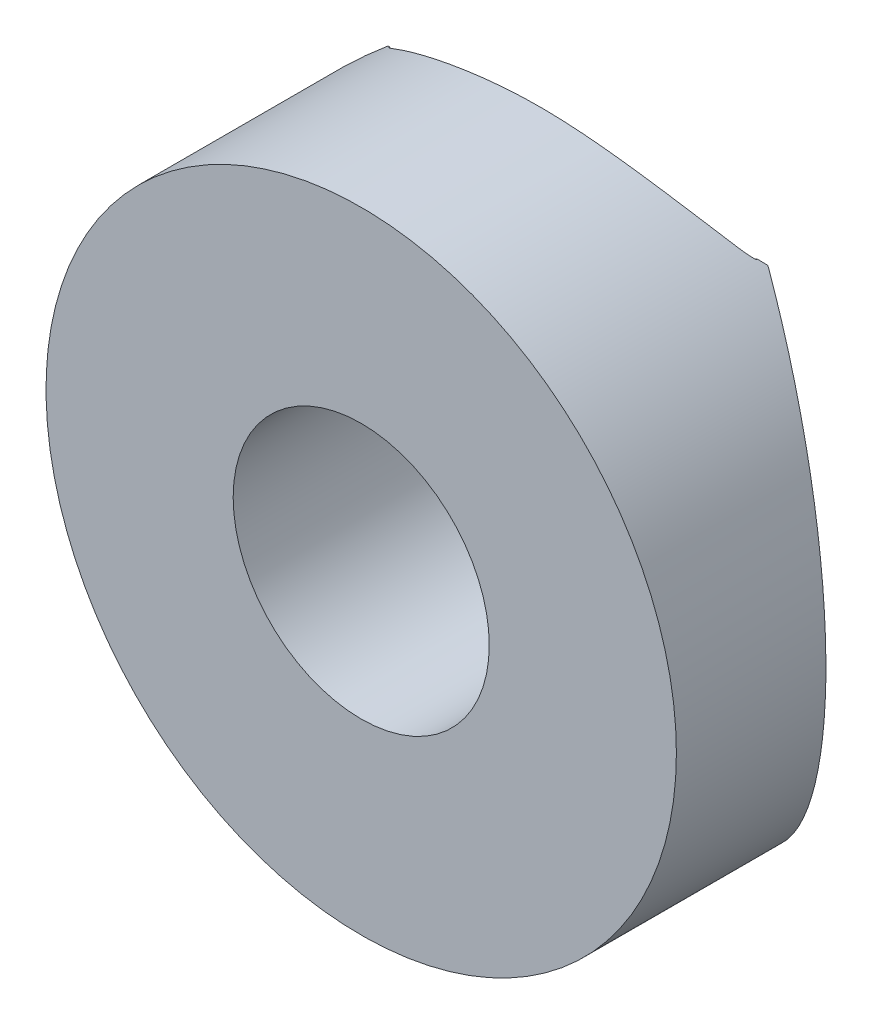
ISO-10303-21;
HEADER;
FILE_DESCRIPTION(('STEP AP214'),'2;1');
FILE_NAME('part.step','',(''),(''),'','','');
FILE_SCHEMA(('AUTOMOTIVE_DESIGN { 1 0 10303 214 1 1 1 1 }'));
ENDSEC;
DATA;
#1=APPLICATION_CONTEXT('core data for automotive mechanical design processes');
#2=APPLICATION_PROTOCOL_DEFINITION('international standard','automotive_design',2000,#1);
#3=PRODUCT_CONTEXT('',#1,'mechanical');
#4=PRODUCT('Part','Part','',(#3));
#5=PRODUCT_RELATED_PRODUCT_CATEGORY('part','',(#4));
#6=PRODUCT_DEFINITION_FORMATION('','',#4);
#7=PRODUCT_DEFINITION_CONTEXT('part definition',#1,'design');
#8=PRODUCT_DEFINITION('design','',#6,#7);
#9=PRODUCT_DEFINITION_SHAPE('','',#8);
#10=(LENGTH_UNIT() NAMED_UNIT(*) SI_UNIT(.MILLI.,.METRE.));
#11=(NAMED_UNIT(*) PLANE_ANGLE_UNIT() SI_UNIT($,.RADIAN.));
#12=(NAMED_UNIT(*) SI_UNIT($,.STERADIAN.) SOLID_ANGLE_UNIT());
#13=UNCERTAINTY_MEASURE_WITH_UNIT(LENGTH_MEASURE(1.E-05),#10,'distance_accuracy_value','');
#14=(GEOMETRIC_REPRESENTATION_CONTEXT(3) GLOBAL_UNCERTAINTY_ASSIGNED_CONTEXT((#13)) GLOBAL_UNIT_ASSIGNED_CONTEXT((#10,
#11,#12)) REPRESENTATION_CONTEXT('',''));
#15=CARTESIAN_POINT('',(0.,0.,0.));
#16=DIRECTION('',(0.,0.,1.));
#17=DIRECTION('',(1.,0.,0.));
#18=AXIS2_PLACEMENT_3D('',#15,#16,#17);
#19=CARTESIAN_POINT('',(0.,0.,0.));
#20=DIRECTION('',(0.,0.,1.));
#21=DIRECTION('',(1.,0.,0.));
#22=AXIS2_PLACEMENT_3D('',#19,#20,#21);
#23=PLANE('',#22);
#24=DIRECTION('',(-1.,0.,0.));
#25=VECTOR('',#24,1.);
#26=CARTESIAN_POINT('',(0.,3.3,0.));
#27=LINE('',#26,#25);
#28=CARTESIAN_POINT('',(4.82231720950153,3.3,0.));
#29=VERTEX_POINT('',#28);
#30=CARTESIAN_POINT('',(3.9126436669125,3.3,0.));
#31=VERTEX_POINT('',#30);
#32=EDGE_CURVE('E152',#29,#31,#27,.T.);
#33=ORIENTED_EDGE('',*,*,#32,.F.);
#34=DIRECTION('',(0.,1.,0.));
#35=VECTOR('',#34,1.);
#36=CARTESIAN_POINT('',(4.82231720950153,-8.,0.));
#37=LINE('',#36,#35);
#38=CARTESIAN_POINT('',(4.82231720950153,-3.3,0.));
#39=VERTEX_POINT('',#38);
#40=EDGE_CURVE('E135',#39,#29,#37,.T.);
#41=ORIENTED_EDGE('',*,*,#40,.F.);
#42=DIRECTION('',(1.,0.,0.));
#43=VECTOR('',#42,1.);
#44=CARTESIAN_POINT('',(0.,-3.3,0.));
#45=LINE('',#44,#43);
#46=CARTESIAN_POINT('',(3.9126436669125,-3.3,0.));
#47=VERTEX_POINT('',#46);
#48=EDGE_CURVE('E150',#47,#39,#45,.T.);
#49=ORIENTED_EDGE('',*,*,#48,.F.);
#50=DIRECTION('',(0.,1.,0.));
#51=VECTOR('',#50,1.);
#52=CARTESIAN_POINT('',(3.9126436669125,-28.7558441227157,0.));
#53=LINE('',#52,#51);
#54=EDGE_CURVE('E48',#47,#31,#53,.T.);
#55=ORIENTED_EDGE('',*,*,#54,.T.);
#56=EDGE_LOOP('',(#33,#41,#49,#55));
#57=FACE_BOUND('',#56,.T.);
#58=ADVANCED_FACE('F32',(#57),#23,.F.);
#59=CARTESIAN_POINT('',(0.,0.,5.5));
#60=DIRECTION('',(0.,0.,-1.));
#61=DIRECTION('',(-1.,0.,0.));
#62=AXIS2_PLACEMENT_3D('',#59,#60,#61);
#63=CYLINDRICAL_SURFACE('',#62,8.);
#64=CARTESIAN_POINT('',(0.,0.,5.5));
#65=DIRECTION('',(0.,0.,1.));
#66=DIRECTION('',(1.,0.,0.));
#67=AXIS2_PLACEMENT_3D('',#64,#65,#66);
#68=CIRCLE('',#67,8.);
#69=CARTESIAN_POINT('',(8.,0.,5.5));
#70=VERTEX_POINT('',#69);
#71=EDGE_CURVE('E461',#70,#70,#68,.T.);
#72=ORIENTED_EDGE('',*,*,#71,.F.);
#73=EDGE_LOOP('',(#72));
#74=FACE_BOUND('',#73,.T.);
#75=CARTESIAN_POINT('',(-4.82231720950153,6.3832011350846,0.));
#76=CARTESIAN_POINT('',(-4.78607049383991,6.41058441722439,0.0263554672161576));
#77=CARTESIAN_POINT('',(-4.74949176221332,6.43773363133695,0.0524981135746098));
#78=CARTESIAN_POINT('',(-4.67568233195936,6.49153909743415,0.104331804622863));
#79=CARTESIAN_POINT('',(-4.63845185069073,6.51819550789308,0.130022994354416));
#80=CARTESIAN_POINT('',(-4.56332714356034,6.5710085680223,0.180945165790684));
#81=CARTESIAN_POINT('',(-4.52543291575765,6.59716521623071,0.206176146149215));
#82=CARTESIAN_POINT('',(-4.44896918703742,6.64897032957273,0.256167884298168));
#83=CARTESIAN_POINT('',(-4.41039946904265,6.67461862547924,0.280928485392226));
#84=CARTESIAN_POINT('',(-4.37149859887903,6.70000000000015,0.305440656498195));
#85=B_SPLINE_CURVE_WITH_KNOTS('',3,(#75,#76,#77,#78,#79,#80,#81,#82,#83,#84),.UNSPECIFIED.,.F.,
.F.,(4,2,2,2,4),(0.,0.157556401690225,0.315061223179688,0.472566505321344,0.630123367948907),.UNSPECIFIED.);
#86=CARTESIAN_POINT('',(-4.82231720950153,6.3832011350846,0.));
#87=VERTEX_POINT('',#86);
#88=CARTESIAN_POINT('',(-4.66368952654441,6.5,0.112489319684063));
#89=VERTEX_POINT('',#88);
#90=EDGE_CURVE('E289',#87,#89,#85,.T.);
#91=ORIENTED_EDGE('',*,*,#90,.F.);
#92=CARTESIAN_POINT('',(0.,0.,-2.58792472289052));
#93=DIRECTION('',(0.472865923331709,0.,0.881134393013716));
#94=DIRECTION('',(0.881134393013716,0.,-0.472865923331709));
#95=AXIS2_PLACEMENT_3D('',#92,#93,#94);
#96=ELLIPSE('',#95,9.07920524204923,8.);
#97=CARTESIAN_POINT('',(-4.82231720950153,-6.3832011350846,0.));
#98=VERTEX_POINT('',#97);
#99=EDGE_CURVE('E467',#87,#98,#96,.T.);
#100=ORIENTED_EDGE('',*,*,#99,.T.);
#101=CARTESIAN_POINT('',(-4.82231720950153,-6.3832011350846,0.));
#102=CARTESIAN_POINT('',(-4.78607049383992,-6.41058441722438,0.0263554672161547));
#103=CARTESIAN_POINT('',(-4.74949176221332,-6.43773363133695,0.0524981135746069));
#104=CARTESIAN_POINT('',(-4.67568233195936,-6.49153909743414,0.10433180462286));
#105=CARTESIAN_POINT('',(-4.63845185069074,-6.51819550789308,0.130022994354414));
#106=CARTESIAN_POINT('',(-4.56332714356035,-6.57100856802229,0.180945165790683));
#107=CARTESIAN_POINT('',(-4.52543291575765,-6.59716521623071,0.206176146149215));
#108=CARTESIAN_POINT('',(-4.44896918703742,-6.64897032957273,0.256167884298169));
#109=CARTESIAN_POINT('',(-4.41039946904264,-6.67461862547924,0.280928485392228));
#110=CARTESIAN_POINT('',(-4.37149859887903,-6.70000000000015,0.305440656498194));
#111=B_SPLINE_CURVE_WITH_KNOTS('',3,(#101,#102,#103,#104,#105,#106,#107,#108,#109,#110),
.UNSPECIFIED.,.F.,.F.,(4,2,2,2,4),(0.,0.157556401690226,0.315061223179691,0.47256650532135,
0.630123367948915),.UNSPECIFIED.);
#112=CARTESIAN_POINT('',(-4.66368952654441,-6.5,0.112489319684062));
#113=VERTEX_POINT('',#112);
#114=EDGE_CURVE('E171',#98,#113,#111,.T.);
#115=ORIENTED_EDGE('',*,*,#114,.T.);
#116=DIRECTION('',(0.,0.,-1.));
#117=VECTOR('',#116,1.);
#118=CARTESIAN_POINT('',(-4.66368952654441,-6.5,5.5));
#119=LINE('',#118,#117);
#120=CARTESIAN_POINT('',(-4.6636895247106,-6.5,0.141893852555122));
#121=VERTEX_POINT('',#120);
#122=EDGE_CURVE('E168',#121,#113,#119,.T.);
#123=ORIENTED_EDGE('',*,*,#122,.F.);
#124=CARTESIAN_POINT('',(-4.66368952654441,-6.5,0.141893851210187));
#125=CARTESIAN_POINT('',(-4.64851021426014,-6.51089135826215,0.153025062973157));
#126=CARTESIAN_POINT('',(-4.63310836498191,-6.52186116989384,0.163770162714116));
#127=CARTESIAN_POINT('',(-4.60194012909562,-6.54389098294828,0.184513599637554));
#128=CARTESIAN_POINT('',(-4.58617465694088,-6.55495072066658,0.194513588784469));
#129=CARTESIAN_POINT('',(-4.55430487806619,-6.57713341970405,0.213833630490758));
#130=CARTESIAN_POINT('',(-4.53820090461463,-6.58825631163056,0.223154314849929));
#131=CARTESIAN_POINT('',(-4.50567924117016,-6.61054029672408,0.241169127495404));
#132=CARTESIAN_POINT('',(-4.4892616233283,-6.62170138063176,0.249863397738221));
#133=CARTESIAN_POINT('',(-4.45612085612094,-6.64404896741107,0.266679697481858));
#134=CARTESIAN_POINT('',(-4.43939737166048,-6.65523548474423,0.274801045343903));
#135=CARTESIAN_POINT('',(-4.40565525846833,-6.67762032242293,0.29051409788505));
#136=CARTESIAN_POINT('',(-4.38863610468772,-6.68881862138895,0.298104706715628));
#137=CARTESIAN_POINT('',(-4.37149859887888,-6.7,0.305440656498145));
#138=B_SPLINE_CURVE_WITH_KNOTS('',3,(#124,#125,#126,#127,#128,#129,#130,#131,#132,#133,#134,
#135,#136,#137),.UNSPECIFIED.,.F.,.F.,(4,2,2,2,2,2,4),(0.,0.0652322644663549,0.130315312886625,
0.195337036027842,0.260343977446011,0.32542700062828,0.390640661813822),.UNSPECIFIED.);
#139=CARTESIAN_POINT('',(-4.37149859887888,-6.7,0.305440656498145));
#140=VERTEX_POINT('',#139);
#141=EDGE_CURVE('E335',#121,#140,#138,.T.);
#142=ORIENTED_EDGE('',*,*,#141,.T.);
#143=CARTESIAN_POINT('',(-4.37149859887888,-6.7,0.305440656498145));
#144=CARTESIAN_POINT('',(-4.26799049005893,-6.76753976622479,0.349759892179706));
#145=CARTESIAN_POINT('',(-4.16235275942081,-6.833039903516,0.392254032239454));
#146=CARTESIAN_POINT('',(-3.94697349358728,-6.95966931954066,0.47334199633237));
#147=CARTESIAN_POINT('',(-3.83723023247483,-7.02079672785678,0.511934154191815));
#148=CARTESIAN_POINT('',(-3.61387571381256,-7.13833531395855,0.584932497285026));
#149=CARTESIAN_POINT('',(-3.50026417973515,-7.19474615357496,0.619338382451168));
#150=CARTESIAN_POINT('',(-3.27006265211156,-7.30224232787404,0.683623766004263));
#151=CARTESIAN_POINT('',(-3.15349111026782,-7.35335370628987,0.713525762601363));
#152=CARTESIAN_POINT('',(-2.91715906188789,-7.450267691487,0.768929184317447));
#153=CARTESIAN_POINT('',(-2.79739908464104,-7.49607117272,0.794431334630257));
#154=CARTESIAN_POINT('',(-2.55507572276486,-7.58209229087695,0.841058362894269));
#155=CARTESIAN_POINT('',(-2.43251259754731,-7.62231044226761,0.862183644088718));
#156=CARTESIAN_POINT('',(-2.12271472024076,-7.71568514944853,0.909726668692023));
#157=CARTESIAN_POINT('',(-1.93394566238462,-7.76518076539851,0.933465460085006));
#158=CARTESIAN_POINT('',(-1.55244491098253,-7.85035895544911,0.972111494901452));
#159=CARTESIAN_POINT('',(-1.35971287414469,-7.88604032754114,0.987017969864927));
#160=CARTESIAN_POINT('',(-0.971490949950143,-7.94322019794669,1.0092265279306));
#161=CARTESIAN_POINT('',(-0.775997963900682,-7.96470120908439,1.01651924136554));
#162=CARTESIAN_POINT('',(-0.383820786206793,-7.99320656326309,1.02497006721691));
#163=CARTESIAN_POINT('',(-0.187136419591693,-8.0002287285282,1.02612725554846));
#164=CARTESIAN_POINT('',(0.210036387169888,-7.99975534203094,1.02389165184453));
#165=CARTESIAN_POINT('',(0.410524031749779,-7.9919733156648,1.02040947493506));
#166=CARTESIAN_POINT('',(0.810155983756035,-7.96139436330747,1.00739642874893));
#167=CARTESIAN_POINT('',(1.00930037171608,-7.93859834569634,0.997865925410824));
#168=CARTESIAN_POINT('',(1.40464828887441,-7.87825506817442,0.971565155402733));
#169=CARTESIAN_POINT('',(1.60085475273698,-7.84072371208814,0.954802692251683));
#170=CARTESIAN_POINT('',(1.98906620379712,-7.75134053635791,0.912968990620794));
#171=CARTESIAN_POINT('',(2.18107165816708,-7.69949031786532,0.887898681071071));
#172=CARTESIAN_POINT('',(2.55015651594824,-7.58499768346162,0.83002458220341));
#173=CARTESIAN_POINT('',(2.72750674152708,-7.5230067284962,0.797658740021983));
#174=CARTESIAN_POINT('',(3.07582556741084,-7.3874370647669,0.724070515189823));
#175=CARTESIAN_POINT('',(3.2467941453699,-7.3138583154321,0.682848101530485));
#176=CARTESIAN_POINT('',(3.58183259358013,-7.15576010551836,0.591045660609467));
#177=CARTESIAN_POINT('',(3.74587458477432,-7.07120115469205,0.540431559788794));
#178=CARTESIAN_POINT('',(3.98545799509975,-6.93718342034553,0.457532075589507));
#179=CARTESIAN_POINT('',(4.0642513463485,-6.89130633939486,0.428730668058433));
#180=CARTESIAN_POINT('',(4.2195850644973,-6.79730404729227,0.368816236997474));
#181=CARTESIAN_POINT('',(4.29612545477236,-6.7491788594784,0.337703237462723));
#182=CARTESIAN_POINT('',(4.37149859887888,-6.7,0.305440656498145));
#183=B_SPLINE_CURVE_WITH_KNOTS('',3,(#143,#144,#145,#146,#147,#148,#149,#150,#151,#152,#153,
#154,#155,#156,#157,#158,#159,#160,#161,#162,#163,#164,#165,#166,#167,#168,#169,#170,#171,#172,
#173,#174,#175,#176,#177,#178,#179,#180,#181,#182),.UNSPECIFIED.,.F.,.F.,(4,2,2,2,2,2,2,2,2,2,2,
2,2,2,2,2,2,2,2,4),(0.,0.393875312222116,0.787918107893238,1.18198913151909,1.57402125623763,
1.96598870336878,2.35792002225956,2.94689881262284,3.53592883985043,4.12568288938185,
4.71552576054055,5.31689883752951,5.91823553344363,6.51892498405843,7.11954729208025,
7.69080910000162,8.262072908056,8.83545132133648,9.12223273532207,9.40901117283186),.UNSPECIFIED.);
#184=CARTESIAN_POINT('',(4.37149859887888,-6.7,0.305440656498145));
#185=VERTEX_POINT('',#184);
#186=EDGE_CURVE('E391',#140,#185,#183,.T.);
#187=ORIENTED_EDGE('',*,*,#186,.T.);
#188=CARTESIAN_POINT('',(4.37149859887888,-6.7,0.305440656498145));
#189=CARTESIAN_POINT('',(4.38863610468772,-6.68881862138895,0.298104706715629));
#190=CARTESIAN_POINT('',(4.40565525846833,-6.67762032242293,0.29051409788505));
#191=CARTESIAN_POINT('',(4.43939737166048,-6.65523548474423,0.274801045343903));
#192=CARTESIAN_POINT('',(4.45612085612094,-6.64404896741107,0.266679697481858));
#193=CARTESIAN_POINT('',(4.4892616233283,-6.62170138063176,0.249863397738221));
#194=CARTESIAN_POINT('',(4.50567924117015,-6.61054029672408,0.241169127495405));
#195=CARTESIAN_POINT('',(4.53820090461463,-6.58825631163056,0.22315431484993));
#196=CARTESIAN_POINT('',(4.55430487806618,-6.57713341970405,0.213833630490758));
#197=CARTESIAN_POINT('',(4.58617465694088,-6.55495072066658,0.19451358878447));
#198=CARTESIAN_POINT('',(4.60194012909562,-6.54389098294829,0.184513599637556));
#199=CARTESIAN_POINT('',(4.63310836498191,-6.52186116989384,0.163770162714119));
#200=CARTESIAN_POINT('',(4.64851021426014,-6.51089135826215,0.153025062973161));
#201=CARTESIAN_POINT('',(4.66368952654441,-6.5,0.141893851210191));
#202=B_SPLINE_CURVE_WITH_KNOTS('',3,(#188,#189,#190,#191,#192,#193,#194,#195,#196,#197,#198,
#199,#200,#201),.UNSPECIFIED.,.F.,.F.,(4,2,2,2,2,2,4),(0.,0.0652136611855415,0.13029668436781,
0.195303625785978,0.260325348927194,0.325408397347463,0.390640661813817),.UNSPECIFIED.);
#203=CARTESIAN_POINT('',(4.6636895247106,-6.5,0.141893852555122));
#204=VERTEX_POINT('',#203);
#205=EDGE_CURVE('E334',#185,#204,#202,.T.);
#206=ORIENTED_EDGE('',*,*,#205,.T.);
#207=DIRECTION('',(0.,0.,-1.));
#208=VECTOR('',#207,1.);
#209=CARTESIAN_POINT('',(4.66368952654441,-6.5,5.5));
#210=LINE('',#209,#208);
#211=CARTESIAN_POINT('',(4.66368952654441,-6.5,0.112489319684063));
#212=VERTEX_POINT('',#211);
#213=EDGE_CURVE('E173',#212,#204,#210,.F.);
#214=ORIENTED_EDGE('',*,*,#213,.F.);
#215=CARTESIAN_POINT('',(4.37149859887888,-6.7,0.305440656498145));
#216=CARTESIAN_POINT('',(4.41039946904259,-6.67461862547919,0.280928485392211));
#217=CARTESIAN_POINT('',(4.4489691870374,-6.64897032957272,0.256167884298166));
#218=CARTESIAN_POINT('',(4.52543291575766,-6.59716521623073,0.206176146149222));
#219=CARTESIAN_POINT('',(4.56332714356035,-6.5710085680223,0.180945165790687));
#220=CARTESIAN_POINT('',(4.63845185069073,-6.51819550789307,0.130022994354414));
#221=CARTESIAN_POINT('',(4.67568233195935,-6.49153909743414,0.104331804622861));
#222=CARTESIAN_POINT('',(4.74949176221332,-6.43773363133695,0.0524981135746084));
#223=CARTESIAN_POINT('',(4.78607049383993,-6.4105844172244,0.0263554672161554));
#224=CARTESIAN_POINT('',(4.82231720950155,-6.38320113508463,0.));
#225=B_SPLINE_CURVE_WITH_KNOTS('',3,(#215,#216,#217,#218,#219,#220,#221,#222,#223,#224),
.UNSPECIFIED.,.F.,.F.,(4,2,2,2,4),(0.,0.15755686262757,0.315062144769232,0.472566966258697,
0.630123367948926),.UNSPECIFIED.);
#226=CARTESIAN_POINT('',(4.82231720950153,-6.3832011350846,0.));
#227=VERTEX_POINT('',#226);
#228=EDGE_CURVE('E183',#212,#227,#225,.T.);
#229=ORIENTED_EDGE('',*,*,#228,.T.);
#230=CARTESIAN_POINT('',(0.,0.,-2.58792472289052));
#231=DIRECTION('',(-0.472865923331709,0.,0.881134393013717));
#232=DIRECTION('',(-0.881134393013717,0.,-0.472865923331709));
#233=AXIS2_PLACEMENT_3D('',#230,#231,#232);
#234=ELLIPSE('',#233,9.07920524204923,8.);
#235=CARTESIAN_POINT('',(4.82231720950153,6.3832011350846,0.));
#236=VERTEX_POINT('',#235);
#237=EDGE_CURVE('E138',#227,#236,#234,.T.);
#238=ORIENTED_EDGE('',*,*,#237,.T.);
#239=CARTESIAN_POINT('',(4.37149859887888,6.7,0.305440656498145));
#240=CARTESIAN_POINT('',(4.41039946904259,6.67461862547919,0.280928485392212));
#241=CARTESIAN_POINT('',(4.4489691870374,6.64897032957273,0.256167884298167));
#242=CARTESIAN_POINT('',(4.52543291575765,6.59716521623073,0.206176146149223));
#243=CARTESIAN_POINT('',(4.56332714356034,6.5710085680223,0.180945165790688));
#244=CARTESIAN_POINT('',(4.63845185069073,6.51819550789307,0.130022994354417));
#245=CARTESIAN_POINT('',(4.67568233195935,6.49153909743414,0.104331804622865));
#246=CARTESIAN_POINT('',(4.74949176221332,6.43773363133696,0.0524981135746128));
#247=CARTESIAN_POINT('',(4.78607049383992,6.4105844172244,0.0263554672161598));
#248=CARTESIAN_POINT('',(4.82231720950154,6.38320113508463,0.));
#249=B_SPLINE_CURVE_WITH_KNOTS('',3,(#239,#240,#241,#242,#243,#244,#245,#246,#247,#248),
.UNSPECIFIED.,.F.,.F.,(4,2,2,2,4),(0.,0.157556862627568,0.315062144769229,0.472566966258691,
0.630123367948919),.UNSPECIFIED.);
#250=CARTESIAN_POINT('',(4.66368952654441,6.5,0.112489319684063));
#251=VERTEX_POINT('',#250);
#252=EDGE_CURVE('E295',#251,#236,#249,.T.);
#253=ORIENTED_EDGE('',*,*,#252,.F.);
#254=DIRECTION('',(0.,0.,-1.));
#255=VECTOR('',#254,1.);
#256=CARTESIAN_POINT('',(4.66368952654441,6.5,5.5));
#257=LINE('',#256,#255);
#258=CARTESIAN_POINT('',(4.6636895247106,6.5,0.141893852555122));
#259=VERTEX_POINT('',#258);
#260=EDGE_CURVE('E453',#259,#251,#257,.T.);
#261=ORIENTED_EDGE('',*,*,#260,.F.);
#262=CARTESIAN_POINT('',(4.37149859887888,6.7,0.305440656498145));
#263=CARTESIAN_POINT('',(4.38863610468772,6.68881862138895,0.298104706715629));
#264=CARTESIAN_POINT('',(4.40565525846833,6.67762032242293,0.29051409788505));
#265=CARTESIAN_POINT('',(4.43939737166048,6.65523548474423,0.274801045343903));
#266=CARTESIAN_POINT('',(4.45612085612094,6.64404896741107,0.266679697481858));
#267=CARTESIAN_POINT('',(4.4892616233283,6.62170138063176,0.249863397738221));
#268=CARTESIAN_POINT('',(4.50567924117015,6.61054029672408,0.241169127495405));
#269=CARTESIAN_POINT('',(4.53820090461463,6.58825631163056,0.22315431484993));
#270=CARTESIAN_POINT('',(4.55430487806618,6.57713341970405,0.213833630490758));
#271=CARTESIAN_POINT('',(4.58617465694088,6.55495072066658,0.19451358878447));
#272=CARTESIAN_POINT('',(4.60194012909562,6.54389098294829,0.184513599637556));
#273=CARTESIAN_POINT('',(4.63310836498191,6.52186116989384,0.163770162714119));
#274=CARTESIAN_POINT('',(4.64851021426014,6.51089135826215,0.153025062973161));
#275=CARTESIAN_POINT('',(4.66368952654441,6.5,0.141893851210191));
#276=B_SPLINE_CURVE_WITH_KNOTS('',3,(#262,#263,#264,#265,#266,#267,#268,#269,#270,#271,#272,
#273,#274,#275),.UNSPECIFIED.,.F.,.F.,(4,2,2,2,2,2,4),(0.,0.0652136611855415,0.13029668436781,
0.195303625785978,0.260325348927194,0.325408397347463,0.390640661813817),.UNSPECIFIED.);
#277=CARTESIAN_POINT('',(4.37149859887888,6.7,0.305440656498145));
#278=VERTEX_POINT('',#277);
#279=EDGE_CURVE('E242',#278,#259,#276,.T.);
#280=ORIENTED_EDGE('',*,*,#279,.F.);
#281=CARTESIAN_POINT('',(-4.37149859887888,6.7,0.305440656498145));
#282=CARTESIAN_POINT('',(-4.26799049005893,6.76753976622479,0.349759892179706));
#283=CARTESIAN_POINT('',(-4.16235275942081,6.833039903516,0.392254032239454));
#284=CARTESIAN_POINT('',(-3.94697349358728,6.95966931954066,0.47334199633237));
#285=CARTESIAN_POINT('',(-3.83723023247483,7.02079672785678,0.511934154191815));
#286=CARTESIAN_POINT('',(-3.61387571381256,7.13833531395855,0.584932497285026));
#287=CARTESIAN_POINT('',(-3.50026417973515,7.19474615357496,0.619338382451168));
#288=CARTESIAN_POINT('',(-3.27006265211156,7.30224232787404,0.683623766004263));
#289=CARTESIAN_POINT('',(-3.15349111026782,7.35335370628987,0.713525762601363));
#290=CARTESIAN_POINT('',(-2.91715906188789,7.450267691487,0.768929184317447));
#291=CARTESIAN_POINT('',(-2.79739908464104,7.49607117272,0.794431334630257));
#292=CARTESIAN_POINT('',(-2.55507572276486,7.58209229087695,0.841058362894269));
#293=CARTESIAN_POINT('',(-2.43251259754731,7.62231044226761,0.862183644088718));
#294=CARTESIAN_POINT('',(-2.12271472024076,7.71568514944853,0.909726668692023));
#295=CARTESIAN_POINT('',(-1.93394566238462,7.76518076539851,0.933465460085006));
#296=CARTESIAN_POINT('',(-1.55244491098253,7.85035895544911,0.972111494901452));
#297=CARTESIAN_POINT('',(-1.35971287414469,7.88604032754114,0.987017969864927));
#298=CARTESIAN_POINT('',(-0.971490949950143,7.94322019794669,1.0092265279306));
#299=CARTESIAN_POINT('',(-0.775997963900682,7.96470120908439,1.01651924136554));
#300=CARTESIAN_POINT('',(-0.383820786206793,7.99320656326309,1.02497006721691));
#301=CARTESIAN_POINT('',(-0.187136419591693,8.0002287285282,1.02612725554846));
#302=CARTESIAN_POINT('',(0.210036387169888,7.99975534203094,1.02389165184453));
#303=CARTESIAN_POINT('',(0.410524031749779,7.9919733156648,1.02040947493506));
#304=CARTESIAN_POINT('',(0.810155983756035,7.96139436330747,1.00739642874893));
#305=CARTESIAN_POINT('',(1.00930037171608,7.93859834569634,0.997865925410824));
#306=CARTESIAN_POINT('',(1.40464828887441,7.87825506817442,0.971565155402733));
#307=CARTESIAN_POINT('',(1.60085475273698,7.84072371208814,0.954802692251683));
#308=CARTESIAN_POINT('',(1.98906620379712,7.75134053635791,0.912968990620794));
#309=CARTESIAN_POINT('',(2.18107165816708,7.69949031786532,0.887898681071071));
#310=CARTESIAN_POINT('',(2.55015651594824,7.58499768346162,0.83002458220341));
#311=CARTESIAN_POINT('',(2.72750674152708,7.5230067284962,0.797658740021983));
#312=CARTESIAN_POINT('',(3.07582556741084,7.3874370647669,0.724070515189823));
#313=CARTESIAN_POINT('',(3.2467941453699,7.3138583154321,0.682848101530485));
#314=CARTESIAN_POINT('',(3.58183259358013,7.15576010551836,0.591045660609467));
#315=CARTESIAN_POINT('',(3.74587458477432,7.07120115469205,0.540431559788794));
#316=CARTESIAN_POINT('',(3.98545799509975,6.93718342034553,0.457532075589507));
#317=CARTESIAN_POINT('',(4.0642513463485,6.89130633939486,0.428730668058433));
#318=CARTESIAN_POINT('',(4.2195850644973,6.79730404729227,0.368816236997474));
#319=CARTESIAN_POINT('',(4.29612545477236,6.7491788594784,0.337703237462723));
#320=CARTESIAN_POINT('',(4.37149859887888,6.7,0.305440656498145));
#321=B_SPLINE_CURVE_WITH_KNOTS('',3,(#281,#282,#283,#284,#285,#286,#287,#288,#289,#290,#291,
#292,#293,#294,#295,#296,#297,#298,#299,#300,#301,#302,#303,#304,#305,#306,#307,#308,#309,#310,
#311,#312,#313,#314,#315,#316,#317,#318,#319,#320),.UNSPECIFIED.,.F.,.F.,(4,2,2,2,2,2,2,2,2,2,2,
2,2,2,2,2,2,2,2,4),(0.,0.393875312222116,0.787918107893238,1.18198913151909,1.57402125623763,
1.96598870336878,2.35792002225956,2.94689881262284,3.53592883985043,4.12568288938185,
4.71552576054055,5.31689883752951,5.91823553344363,6.51892498405843,7.11954729208025,
7.69080910000162,8.262072908056,8.83545132133648,9.12223273532207,9.40901117283186),.UNSPECIFIED.);
#322=CARTESIAN_POINT('',(-4.37149859887888,6.7,0.305440656498145));
#323=VERTEX_POINT('',#322);
#324=EDGE_CURVE('E247',#323,#278,#321,.T.);
#325=ORIENTED_EDGE('',*,*,#324,.F.);
#326=CARTESIAN_POINT('',(-4.66368952654441,6.5,0.141893851210187));
#327=CARTESIAN_POINT('',(-4.64851021426014,6.51089135826215,0.153025062973157));
#328=CARTESIAN_POINT('',(-4.63310836498191,6.52186116989384,0.163770162714116));
#329=CARTESIAN_POINT('',(-4.60194012909562,6.54389098294828,0.184513599637554));
#330=CARTESIAN_POINT('',(-4.58617465694088,6.55495072066658,0.194513588784469));
#331=CARTESIAN_POINT('',(-4.55430487806619,6.57713341970405,0.213833630490758));
#332=CARTESIAN_POINT('',(-4.53820090461463,6.58825631163056,0.223154314849929));
#333=CARTESIAN_POINT('',(-4.50567924117016,6.61054029672408,0.241169127495404));
#334=CARTESIAN_POINT('',(-4.4892616233283,6.62170138063176,0.249863397738221));
#335=CARTESIAN_POINT('',(-4.45612085612094,6.64404896741107,0.266679697481858));
#336=CARTESIAN_POINT('',(-4.43939737166048,6.65523548474423,0.274801045343903));
#337=CARTESIAN_POINT('',(-4.40565525846833,6.67762032242293,0.29051409788505));
#338=CARTESIAN_POINT('',(-4.38863610468772,6.68881862138895,0.298104706715628));
#339=CARTESIAN_POINT('',(-4.37149859887888,6.7,0.305440656498145));
#340=B_SPLINE_CURVE_WITH_KNOTS('',3,(#326,#327,#328,#329,#330,#331,#332,#333,#334,#335,#336,
#337,#338,#339),.UNSPECIFIED.,.F.,.F.,(4,2,2,2,2,2,4),(0.,0.0652322644663549,0.130315312886625,
0.195337036027842,0.260343977446011,0.32542700062828,0.390640661813822),.UNSPECIFIED.);
#341=CARTESIAN_POINT('',(-4.6636895247106,6.5,0.141893852555122));
#342=VERTEX_POINT('',#341);
#343=EDGE_CURVE('E253',#342,#323,#340,.T.);
#344=ORIENTED_EDGE('',*,*,#343,.F.);
#345=DIRECTION('',(0.,0.,-1.));
#346=VECTOR('',#345,1.);
#347=CARTESIAN_POINT('',(-4.66368952654441,6.5,5.5));
#348=LINE('',#347,#346);
#349=EDGE_CURVE('E258',#89,#342,#348,.F.);
#350=ORIENTED_EDGE('',*,*,#349,.F.);
#351=EDGE_LOOP('',(#91,#100,#115,#123,#142,#187,#206,#214,#229,#238,#253,#261,#280,#325,#344,#350));
#352=FACE_BOUND('',#351,.T.);
#353=ADVANCED_FACE('F34',(#74,#352),#63,.T.);
#354=CARTESIAN_POINT('',(0.,6.7,-6.63213817188283));
#355=DIRECTION('',(0.,-1.,0.));
#356=DIRECTION('',(0.,0.,-1.));
#357=AXIS2_PLACEMENT_3D('',#354,#355,#356);
#358=CYLINDRICAL_SURFACE('',#357,8.2);
#359=CARTESIAN_POINT('',(0.,6.7,-6.63213817188283));
#360=DIRECTION('',(0.,1.,0.));
#361=DIRECTION('',(0.,0.,1.));
#362=AXIS2_PLACEMENT_3D('',#359,#360,#361);
#363=CIRCLE('',#362,8.2);
#364=EDGE_CURVE('E452',#323,#278,#363,.T.);
#365=ORIENTED_EDGE('',*,*,#364,.T.);
#366=DIRECTION('',(0.,-1.,0.));
#367=VECTOR('',#366,1.);
#368=CARTESIAN_POINT('',(4.37149859887888,9.9,0.305440656498145));
#369=LINE('',#368,#367);
#370=CARTESIAN_POINT('',(4.37149859887888,6.5,0.305440656498145));
#371=VERTEX_POINT('',#370);
#372=EDGE_CURVE('E234',#278,#371,#369,.T.);
#373=ORIENTED_EDGE('',*,*,#372,.T.);
#374=CARTESIAN_POINT('',(0.,6.5,-6.63213817188283));
#375=DIRECTION('',(0.,1.,0.));
#376=DIRECTION('',(0.,0.,1.));
#377=AXIS2_PLACEMENT_3D('',#374,#375,#376);
#378=CIRCLE('',#377,8.2);
#379=EDGE_CURVE('E161',#371,#251,#378,.T.);
#380=ORIENTED_EDGE('',*,*,#379,.T.);
#381=ORIENTED_EDGE('',*,*,#252,.T.);
#382=DIRECTION('',(0.,-1.,0.));
#383=VECTOR('',#382,1.);
#384=CARTESIAN_POINT('',(4.82231720950153,6.7,0.));
#385=LINE('',#384,#383);
#386=EDGE_CURVE('E451',#236,#29,#385,.T.);
#387=ORIENTED_EDGE('',*,*,#386,.T.);
#388=CARTESIAN_POINT('',(0.,3.3,-6.63213817188283));
#389=DIRECTION('',(0.,1.,0.));
#390=DIRECTION('',(0.,0.,1.));
#391=AXIS2_PLACEMENT_3D('',#388,#389,#390);
#392=CIRCLE('',#391,8.2);
#393=CARTESIAN_POINT('',(-4.82231720950153,3.3,0.));
#394=VERTEX_POINT('',#393);
#395=EDGE_CURVE('E445',#394,#29,#392,.T.);
#396=ORIENTED_EDGE('',*,*,#395,.F.);
#397=DIRECTION('',(0.,-1.,0.));
#398=VECTOR('',#397,1.);
#399=CARTESIAN_POINT('',(-4.82231720950153,6.7,0.));
#400=LINE('',#399,#398);
#401=EDGE_CURVE('E450',#394,#87,#400,.F.);
#402=ORIENTED_EDGE('',*,*,#401,.T.);
#403=ORIENTED_EDGE('',*,*,#90,.T.);
#404=CARTESIAN_POINT('',(-4.37149859887888,6.5,0.305440656498145));
#405=VERTEX_POINT('',#404);
#406=EDGE_CURVE('E308',#89,#405,#378,.T.);
#407=ORIENTED_EDGE('',*,*,#406,.T.);
#408=DIRECTION('',(0.,-1.,0.));
#409=VECTOR('',#408,1.);
#410=CARTESIAN_POINT('',(-4.37149859887888,9.9,0.305440656498145));
#411=LINE('',#410,#409);
#412=EDGE_CURVE('E240',#323,#405,#411,.T.);
#413=ORIENTED_EDGE('',*,*,#412,.F.);
#414=EDGE_LOOP('',(#365,#373,#380,#381,#387,#396,#402,#403,#407,#413));
#415=FACE_BOUND('',#414,.T.);
#416=ADVANCED_FACE('F279',(#415),#358,.F.);
#417=CARTESIAN_POINT('',(0.,6.7,-6.63213817188283));
#418=DIRECTION('',(0.,1.,0.));
#419=DIRECTION('',(0.,0.,1.));
#420=AXIS2_PLACEMENT_3D('',#417,#418,#419);
#421=PLANE('',#420);
#422=CARTESIAN_POINT('',(-4.37149859887888,6.7,0.305440656498145));
#423=CARTESIAN_POINT('',(-2.96114295151235,6.7,0.909091440497192));
#424=CARTESIAN_POINT('',(-0.0365681004894004,6.7,1.15670377365685));
#425=CARTESIAN_POINT('',(3.03427915249115,6.7,0.877788183661229));
#426=CARTESIAN_POINT('',(4.37149859887888,6.7,0.305440656498145));
#427=B_SPLINE_CURVE_WITH_KNOTS('',3,(#422,#423,#424,#425,#426),.UNSPECIFIED.,.F.,.F.,(4,1,4),
(0.,0.5,1.),.UNSPECIFIED.);
#428=EDGE_CURVE('E303',#278,#323,#427,.F.);
#429=ORIENTED_EDGE('',*,*,#428,.F.);
#430=ORIENTED_EDGE('',*,*,#364,.F.);
#431=EDGE_LOOP('',(#429,#430));
#432=FACE_BOUND('',#431,.T.);
#433=ADVANCED_FACE('F275',(#432),#421,.F.);
#434=CARTESIAN_POINT('',(-4.82231720950153,-3.3,0.));
#435=VERTEX_POINT('',#434);
#436=CARTESIAN_POINT('',(-3.9126436669125,-3.3,0.));
#437=VERTEX_POINT('',#436);
#438=EDGE_CURVE('E160',#435,#437,#45,.T.);
#439=ORIENTED_EDGE('',*,*,#438,.F.);
#440=DIRECTION('',(0.,1.,0.));
#441=VECTOR('',#440,1.);
#442=CARTESIAN_POINT('',(-4.82231720950153,-8.,0.));
#443=LINE('',#442,#441);
#444=EDGE_CURVE('E56',#435,#394,#443,.T.);
#445=ORIENTED_EDGE('',*,*,#444,.T.);
#446=CARTESIAN_POINT('',(-3.9126436669125,3.3,0.));
#447=VERTEX_POINT('',#446);
#448=EDGE_CURVE('E301',#447,#394,#27,.T.);
#449=ORIENTED_EDGE('',*,*,#448,.F.);
#450=DIRECTION('',(0.,1.,0.));
#451=VECTOR('',#450,1.);
#452=CARTESIAN_POINT('',(-3.9126436669125,-28.7558441227157,0.));
#453=LINE('',#452,#451);
#454=EDGE_CURVE('E408',#447,#437,#453,.F.);
#455=ORIENTED_EDGE('',*,*,#454,.T.);
#456=EDGE_LOOP('',(#439,#445,#449,#455));
#457=FACE_BOUND('',#456,.T.);
#458=ADVANCED_FACE('F278',(#457),#23,.F.);
#459=CARTESIAN_POINT('',(0.,0.,5.5));
#460=DIRECTION('',(0.,0.,1.));
#461=DIRECTION('',(1.,0.,0.));
#462=AXIS2_PLACEMENT_3D('',#459,#460,#461);
#463=PLANE('',#462);
#464=ORIENTED_EDGE('',*,*,#71,.T.);
#465=EDGE_LOOP('',(#464));
#466=FACE_BOUND('',#465,.T.);
#467=CARTESIAN_POINT('',(0.,0.,5.5));
#468=DIRECTION('',(0.,0.,1.));
#469=DIRECTION('',(1.,0.,0.));
#470=AXIS2_PLACEMENT_3D('',#467,#468,#469);
#471=CIRCLE('',#470,3.25);
#472=CARTESIAN_POINT('',(3.25,0.,5.5));
#473=VERTEX_POINT('',#472);
#474=EDGE_CURVE('E459',#473,#473,#471,.T.);
#475=ORIENTED_EDGE('',*,*,#474,.F.);
#476=EDGE_LOOP('',(#475));
#477=FACE_BOUND('',#476,.T.);
#478=ADVANCED_FACE('F435',(#466,#477),#463,.T.);
#479=CARTESIAN_POINT('',(0.,0.,5.5));
#480=DIRECTION('',(0.,0.,-1.));
#481=DIRECTION('',(-1.,0.,0.));
#482=AXIS2_PLACEMENT_3D('',#479,#480,#481);
#483=CYLINDRICAL_SURFACE('',#482,3.25);
#484=CARTESIAN_POINT('',(-3.25,0.,0.287693164833319));
#485=CARTESIAN_POINT('',(-3.25000438392943,-0.176039636949832,0.287689264220905));
#486=CARTESIAN_POINT('',(-3.23564906537538,-0.352049218484604,0.293292198088854));
#487=CARTESIAN_POINT('',(-3.17884471395196,-0.698793088906138,0.314955695575915));
#488=CARTESIAN_POINT('',(-3.13639480734908,-0.869527213554869,0.331016584434142));
#489=CARTESIAN_POINT('',(-3.02513618814615,-1.20062636931594,0.371544549476959));
#490=CARTESIAN_POINT('',(-2.95638656330443,-1.36101370939137,0.395992769171533));
#491=CARTESIAN_POINT('',(-2.79468707582899,-1.66803762851098,0.450511363068947));
#492=CARTESIAN_POINT('',(-2.70173054596401,-1.81467040402068,0.48058328554624));
#493=CARTESIAN_POINT('',(-2.48967342435973,-2.09677139140984,0.544512180323998));
#494=CARTESIAN_POINT('',(-2.36964189252356,-2.23151603873365,0.578474861879332));
#495=CARTESIAN_POINT('',(-2.10882121356721,-2.47946774495871,0.645472806473648));
#496=CARTESIAN_POINT('',(-1.96802804937799,-2.59267062611612,0.67850788856004));
#497=CARTESIAN_POINT('',(-1.66425805628477,-2.79774014647259,0.741173664181687));
#498=CARTESIAN_POINT('',(-1.50072576761012,-2.88883008625402,0.7706658267524));
#499=CARTESIAN_POINT('',(-1.15940728180178,-3.0419111978211,0.821660920718669));
#500=CARTESIAN_POINT('',(-0.981625664116367,-3.10391167482133,0.843166406454123));
#501=CARTESIAN_POINT('',(-0.624455191839955,-3.19454541328072,0.875015273283935));
#502=CARTESIAN_POINT('',(-0.44541958959406,-3.22442222931045,0.885773410839445));
#503=CARTESIAN_POINT('',(-0.0845742758667099,-3.25393454661393,0.896398298854071));
#504=CARTESIAN_POINT('',(0.0972345821942276,-3.25357917081243,0.896268334927953));
#505=CARTESIAN_POINT('',(0.449590884740524,-3.22338377504903,0.885401484286598));
#506=CARTESIAN_POINT('',(0.620272033642083,-3.19489870585019,0.875152037402188));
#507=CARTESIAN_POINT('',(0.954244934114621,-3.11151836880413,0.845827734119497));
#508=CARTESIAN_POINT('',(1.11753616693699,-3.05662125005138,0.826752259213776));
#509=CARTESIAN_POINT('',(1.43482831963446,-2.92129157007954,0.781344888205611));
#510=CARTESIAN_POINT('',(1.58866507398603,-2.8405086515492,0.754914126798119));
#511=CARTESIAN_POINT('',(1.88096957356079,-2.65600255333065,0.697497587647859));
#512=CARTESIAN_POINT('',(2.01943255183983,-2.55227228803112,0.666510403980141));
#513=CARTESIAN_POINT('',(2.28507246560723,-2.31818196078106,0.6012025998858));
#514=CARTESIAN_POINT('',(2.41121979598585,-2.1866767968593,0.566792352738313));
#515=CARTESIAN_POINT('',(2.64004008920804,-1.90413896228168,0.499895531233396));
#516=CARTESIAN_POINT('',(2.74270800739311,-1.75310210604487,0.467409371383812));
#517=CARTESIAN_POINT('',(2.92342815499662,-1.43200584335271,0.407498749131994));
#518=CARTESIAN_POINT('',(3.00096804507398,-1.26163601689571,0.380183860323822));
#519=CARTESIAN_POINT('',(3.12588099366586,-0.909013861946836,0.334972219525431));
#520=CARTESIAN_POINT('',(3.17326937975637,-0.726767622882216,0.317070683043718));
#521=CARTESIAN_POINT('',(3.23427766341298,-0.365677015568459,0.293825120526366));
#522=CARTESIAN_POINT('',(3.2495202586688,-0.187145786542011,0.287878410581936));
#523=CARTESIAN_POINT('',(3.25045708525841,0.169983742693415,0.287516692309765));
#524=CARTESIAN_POINT('',(3.23615795540746,0.348582018817103,0.293099093082582));
#525=CARTESIAN_POINT('',(3.1798844602978,0.692789898754444,0.314558225269697));
#526=CARTESIAN_POINT('',(3.13911907115442,0.858628390315273,0.329984773530678));
#527=CARTESIAN_POINT('',(3.03256678639798,1.18105140840256,0.368873319534881));
#528=CARTESIAN_POINT('',(2.9667749936878,1.33763411685014,0.392336889850774));
#529=CARTESIAN_POINT('',(2.80939000868184,1.64329769879937,0.445686631698402));
#530=CARTESIAN_POINT('',(2.71696100972007,1.79191247831978,0.475771859268864));
#531=CARTESIAN_POINT('',(2.50983397333643,2.07210281906213,0.538623263787522));
#532=CARTESIAN_POINT('',(2.39512831187348,2.2036725209453,0.571390356358726));
#533=CARTESIAN_POINT('',(2.13882157725857,2.45394477269154,0.638211077965093));
#534=CARTESIAN_POINT('',(1.99604640291798,2.57145835034811,0.672229090740488));
#535=CARTESIAN_POINT('',(1.69196367825586,2.78097863121619,0.735879091043915));
#536=CARTESIAN_POINT('',(1.53065636415366,2.87298565949514,0.765511134466553));
#537=CARTESIAN_POINT('',(1.19447579750887,3.02817148488702,0.81698170900958));
#538=CARTESIAN_POINT('',(1.01967137954177,3.09148654053426,0.838856967037029));
#539=CARTESIAN_POINT('',(0.6609317156146,3.18749213967639,0.87249100133561));
#540=CARTESIAN_POINT('',(0.477000447471936,3.2201959033742,0.884254144580934));
#541=CARTESIAN_POINT('',(0.116016473599289,3.25270392988589,0.895953373333064));
#542=CARTESIAN_POINT('',(-0.060865336224649,3.25420286402988,0.896498657936532));
#543=CARTESIAN_POINT('',(-0.412246858718593,3.22855618229217,0.887258622942568));
#544=CARTESIAN_POINT('',(-0.58674682235088,3.20141360818228,0.877474400354485));
#545=CARTESIAN_POINT('',(-0.924661385269039,3.12042618911417,0.848935382292029));
#546=CARTESIAN_POINT('',(-1.08823287997341,3.06716200552397,0.830375960424906));
#547=CARTESIAN_POINT('',(-1.40414981342904,2.93600620098557,0.786210161922539));
#548=CARTESIAN_POINT('',(-1.55649313481198,2.85810994958866,0.760602460436855));
#549=CARTESIAN_POINT('',(-1.85237917805173,2.67629492398317,0.703638065137281));
#550=CARTESIAN_POINT('',(-1.99531522029837,2.57144965806668,0.672090475137417));
#551=CARTESIAN_POINT('',(-2.26209987304081,2.34021164303849,0.607151280728524));
#552=CARTESIAN_POINT('',(-2.38594186349436,2.21381145252766,0.573759042192706));
#553=CARTESIAN_POINT('',(-2.61711945400753,1.93582081952102,0.506948902322298));
#554=CARTESIAN_POINT('',(-2.72337690210322,1.78331223502829,0.473606762379652));
#555=CARTESIAN_POINT('',(-2.90875349677337,1.46154633979985,0.412541531484742));
#556=CARTESIAN_POINT('',(-2.98787349820162,1.29228955686379,0.384818263544255));
#557=CARTESIAN_POINT('',(-3.11704442830944,0.93929780619616,0.338260789896676));
#558=CARTESIAN_POINT('',(-3.16671173797426,0.755405715100262,0.319544465512279));
#559=CARTESIAN_POINT('',(-3.23317838233555,0.380994958879253,0.294266006154885));
#560=CARTESIAN_POINT('',(-3.24999525646389,0.190479885218452,0.287697385406696));
#561=CARTESIAN_POINT('',(-3.25,0.,0.287693164833319));
#562=B_SPLINE_CURVE_WITH_KNOTS('',3,(#484,#485,#486,#487,#488,#489,#490,#491,#492,#493,#494,
#495,#496,#497,#498,#499,#500,#501,#502,#503,#504,#505,#506,#507,#508,#509,#510,#511,#512,#513,
#514,#515,#516,#517,#518,#519,#520,#521,#522,#523,#524,#525,#526,#527,#528,#529,#530,#531,#532,
#533,#534,#535,#536,#537,#538,#539,#540,#541,#542,#543,#544,#545,#546,#547,#548,#549,#550,#551,
#552,#553,#554,#555,#556,#557,#558,#559,#560,#561),.UNSPECIFIED.,.T.,.F.,(4,2,2,2,2,2,2,2,2,2,2,
2,2,2,2,2,2,2,2,2,2,2,2,2,2,2,2,2,2,2,2,2,2,2,2,2,2,2,4),(0.,0.52741095118966,1.05483830547763,
1.5810875791938,2.10748194966574,2.65589495457328,3.2044142088588,3.77006295385366,
4.33553063405477,4.87821893302077,5.42074346989591,5.93835038103702,6.45599357035718,
6.98096189514155,7.50609254485138,8.05990739540784,8.61384112404781,9.17844665551065,
9.7427649388464,10.2778389339123,10.812792696629,11.3248822351718,11.8370720295628,
12.3675117595016,12.8981333498877,13.4595324433467,14.0209243817434,14.5796215812471,
15.1380773828092,15.6661204365601,16.1941074169777,16.7108560702506,17.2277019221036,
17.7654891782366,18.3034624717369,18.8672682070966,19.4310561804412,20.0020347426703,
20.5727083658736),.UNSPECIFIED.);
#563=CARTESIAN_POINT('',(-3.25,0.,0.287693164833319));
#564=VERTEX_POINT('',#563);
#565=EDGE_CURVE('E410',#564,#564,#562,.T.);
#566=ORIENTED_EDGE('',*,*,#565,.F.);
#567=EDGE_LOOP('',(#566));
#568=FACE_BOUND('',#567,.T.);
#569=ORIENTED_EDGE('',*,*,#474,.T.);
#570=EDGE_LOOP('',(#569));
#571=FACE_BOUND('',#570,.T.);
#572=ADVANCED_FACE('F273',(#568,#571),#483,.F.);
#573=CARTESIAN_POINT('',(0.,3.3,-6.63213817188283));
#574=DIRECTION('',(0.,1.,0.));
#575=DIRECTION('',(0.,0.,1.));
#576=AXIS2_PLACEMENT_3D('',#573,#574,#575);
#577=PLANE('',#576);
#578=CARTESIAN_POINT('',(0.,3.3,-8.10501200096394));
#579=DIRECTION('',(0.,1.,0.));
#580=DIRECTION('',(0.,0.,1.));
#581=AXIS2_PLACEMENT_3D('',#578,#579,#580);
#582=CIRCLE('',#581,9.);
#583=EDGE_CURVE('E446',#447,#31,#582,.T.);
#584=ORIENTED_EDGE('',*,*,#583,.F.);
#585=ORIENTED_EDGE('',*,*,#448,.T.);
#586=ORIENTED_EDGE('',*,*,#395,.T.);
#587=ORIENTED_EDGE('',*,*,#32,.T.);
#588=EDGE_LOOP('',(#584,#585,#586,#587));
#589=FACE_BOUND('',#588,.T.);
#590=ADVANCED_FACE('F264',(#589),#577,.T.);
#591=CARTESIAN_POINT('',(-4.37149859887888,9.9,0.305440656498145));
#592=CARTESIAN_POINT('',(-2.96114295151235,9.9,0.909091440497192));
#593=CARTESIAN_POINT('',(-0.0365681004894004,9.9,1.15670377365685));
#594=CARTESIAN_POINT('',(3.03427915249115,9.9,0.877788183661229));
#595=CARTESIAN_POINT('',(4.37149859887888,9.9,0.305440656498145));
#596=B_SPLINE_CURVE_WITH_KNOTS('',3,(#591,#592,#593,#594,#595),.UNSPECIFIED.,.F.,.F.,(4,1,4),
(0.,0.5,1.),.UNSPECIFIED.);
#597=DIRECTION('',(0.,-1.,0.));
#598=VECTOR('',#597,1.);
#599=SURFACE_OF_LINEAR_EXTRUSION('',#596,#598);
#600=ORIENTED_EDGE('',*,*,#324,.T.);
#601=ORIENTED_EDGE('',*,*,#428,.T.);
#602=EDGE_LOOP('',(#600,#601));
#603=FACE_BOUND('',#602,.T.);
#604=ADVANCED_FACE('F207',(#603),#599,.T.);
#605=CARTESIAN_POINT('',(-5.0298167072384,6.5,-0.391226102186711));
#606=DIRECTION('',(0.,1.,0.));
#607=DIRECTION('',(0.,0.,1.));
#608=AXIS2_PLACEMENT_3D('',#605,#606,#607);
#609=PLANE('',#608);
#610=ORIENTED_EDGE('',*,*,#349,.T.);
#611=CARTESIAN_POINT('',(-4.82231720950153,6.5,-1.54710741069984));
#612=CARTESIAN_POINT('',(-5.24925607669157,6.5,-0.623448355081662));
#613=CARTESIAN_POINT('',(-5.09898320648403,6.5,-0.00593233268233333));
#614=CARTESIAN_POINT('',(-4.37149859887888,6.5,0.305440656498145));
#615=B_SPLINE_CURVE_WITH_KNOTS('',3,(#611,#612,#613,#614),.UNSPECIFIED.,.F.,.F.,(4,4),(0.,1.),.UNSPECIFIED.);
#616=EDGE_CURVE('E219',#342,#405,#615,.T.);
#617=ORIENTED_EDGE('',*,*,#616,.T.);
#618=ORIENTED_EDGE('',*,*,#406,.F.);
#619=EDGE_LOOP('',(#610,#617,#618));
#620=FACE_BOUND('',#619,.T.);
#621=ADVANCED_FACE('F201',(#620),#609,.T.);
#622=CARTESIAN_POINT('',(-4.82231720950153,9.9,-1.54710741069984));
#623=CARTESIAN_POINT('',(-5.24925607669157,9.9,-0.623448355081662));
#624=CARTESIAN_POINT('',(-5.09898320648403,9.9,-0.00593233268233333));
#625=CARTESIAN_POINT('',(-4.37149859887888,9.9,0.305440656498145));
#626=B_SPLINE_CURVE_WITH_KNOTS('',3,(#622,#623,#624,#625),.UNSPECIFIED.,.F.,.F.,(4,4),(0.,1.),.UNSPECIFIED.);
#627=DIRECTION('',(0.,-1.,0.));
#628=VECTOR('',#627,1.);
#629=SURFACE_OF_LINEAR_EXTRUSION('',#626,#628);
#630=ORIENTED_EDGE('',*,*,#343,.T.);
#631=ORIENTED_EDGE('',*,*,#412,.T.);
#632=ORIENTED_EDGE('',*,*,#616,.F.);
#633=EDGE_LOOP('',(#630,#631,#632));
#634=FACE_BOUND('',#633,.T.);
#635=ADVANCED_FACE('F199',(#634),#629,.T.);
#636=ORIENTED_EDGE('',*,*,#260,.T.);
#637=ORIENTED_EDGE('',*,*,#379,.F.);
#638=CARTESIAN_POINT('',(4.37149859887888,6.5,0.305440656498145));
#639=CARTESIAN_POINT('',(5.09898320648403,6.5,-0.00593233268233333));
#640=CARTESIAN_POINT('',(5.24925607669157,6.5,-0.623448355081662));
#641=CARTESIAN_POINT('',(4.82231720950153,6.5,-1.54710741069984));
#642=B_SPLINE_CURVE_WITH_KNOTS('',3,(#638,#639,#640,#641),.UNSPECIFIED.,.F.,.F.,(4,4),(0.,1.),.UNSPECIFIED.);
#643=EDGE_CURVE('E226',#371,#259,#642,.T.);
#644=ORIENTED_EDGE('',*,*,#643,.T.);
#645=EDGE_LOOP('',(#636,#637,#644));
#646=FACE_BOUND('',#645,.T.);
#647=ADVANCED_FACE('F195',(#646),#609,.T.);
#648=CARTESIAN_POINT('',(4.37149859887888,9.9,0.305440656498145));
#649=CARTESIAN_POINT('',(5.09898320648403,9.9,-0.00593233268233333));
#650=CARTESIAN_POINT('',(5.24925607669157,9.9,-0.623448355081662));
#651=CARTESIAN_POINT('',(4.82231720950153,9.9,-1.54710741069984));
#652=B_SPLINE_CURVE_WITH_KNOTS('',3,(#648,#649,#650,#651),.UNSPECIFIED.,.F.,.F.,(4,4),(0.,1.),.UNSPECIFIED.);
#653=DIRECTION('',(0.,-1.,0.));
#654=VECTOR('',#653,1.);
#655=SURFACE_OF_LINEAR_EXTRUSION('',#652,#654);
#656=ORIENTED_EDGE('',*,*,#279,.T.);
#657=ORIENTED_EDGE('',*,*,#643,.F.);
#658=ORIENTED_EDGE('',*,*,#372,.F.);
#659=EDGE_LOOP('',(#656,#657,#658));
#660=FACE_BOUND('',#659,.T.);
#661=ADVANCED_FACE('F193',(#660),#655,.T.);
#662=CARTESIAN_POINT('',(0.,-6.7,-6.63213817188283));
#663=DIRECTION('',(0.,1.,0.));
#664=DIRECTION('',(0.,0.,1.));
#665=AXIS2_PLACEMENT_3D('',#662,#663,#664);
#666=CYLINDRICAL_SURFACE('',#665,8.2);
#667=CARTESIAN_POINT('',(0.,-6.7,-6.63213817188283));
#668=DIRECTION('',(0.,1.,0.));
#669=DIRECTION('',(0.,0.,1.));
#670=AXIS2_PLACEMENT_3D('',#667,#668,#669);
#671=CIRCLE('',#670,8.2);
#672=EDGE_CURVE('E167',#140,#185,#671,.T.);
#673=ORIENTED_EDGE('',*,*,#672,.F.);
#674=DIRECTION('',(0.,1.,0.));
#675=VECTOR('',#674,1.);
#676=CARTESIAN_POINT('',(-4.37149859887888,-9.9,0.305440656498145));
#677=LINE('',#676,#675);
#678=CARTESIAN_POINT('',(-4.37149859887888,-6.5,0.305440656498145));
#679=VERTEX_POINT('',#678);
#680=EDGE_CURVE('E398',#140,#679,#677,.T.);
#681=ORIENTED_EDGE('',*,*,#680,.T.);
#682=CARTESIAN_POINT('',(0.,-6.5,-6.63213817188283));
#683=DIRECTION('',(0.,-1.,0.));
#684=DIRECTION('',(0.,0.,-1.));
#685=AXIS2_PLACEMENT_3D('',#682,#683,#684);
#686=CIRCLE('',#685,8.2);
#687=EDGE_CURVE('E11',#113,#679,#686,.F.);
#688=ORIENTED_EDGE('',*,*,#687,.F.);
#689=ORIENTED_EDGE('',*,*,#114,.F.);
#690=DIRECTION('',(0.,1.,0.));
#691=VECTOR('',#690,1.);
#692=CARTESIAN_POINT('',(-4.82231720950153,-6.7,0.));
#693=LINE('',#692,#691);
#694=EDGE_CURVE('E144',#435,#98,#693,.F.);
#695=ORIENTED_EDGE('',*,*,#694,.F.);
#696=CARTESIAN_POINT('',(0.,-3.3,-6.63213817188283));
#697=DIRECTION('',(0.,1.,0.));
#698=DIRECTION('',(0.,0.,1.));
#699=AXIS2_PLACEMENT_3D('',#696,#697,#698);
#700=CIRCLE('',#699,8.2);
#701=EDGE_CURVE('E157',#435,#39,#700,.T.);
#702=ORIENTED_EDGE('',*,*,#701,.T.);
#703=DIRECTION('',(0.,1.,0.));
#704=VECTOR('',#703,1.);
#705=CARTESIAN_POINT('',(4.82231720950153,-6.7,0.));
#706=LINE('',#705,#704);
#707=EDGE_CURVE('E132',#227,#39,#706,.T.);
#708=ORIENTED_EDGE('',*,*,#707,.F.);
#709=ORIENTED_EDGE('',*,*,#228,.F.);
#710=CARTESIAN_POINT('',(4.37149859887888,-6.5,0.305440656498145));
#711=VERTEX_POINT('',#710);
#712=EDGE_CURVE('E37',#711,#212,#686,.F.);
#713=ORIENTED_EDGE('',*,*,#712,.F.);
#714=DIRECTION('',(0.,1.,0.));
#715=VECTOR('',#714,1.);
#716=CARTESIAN_POINT('',(4.37149859887888,-9.9,0.305440656498145));
#717=LINE('',#716,#715);
#718=EDGE_CURVE('E396',#185,#711,#717,.T.);
#719=ORIENTED_EDGE('',*,*,#718,.F.);
#720=EDGE_LOOP('',(#673,#681,#688,#689,#695,#702,#708,#709,#713,#719));
#721=FACE_BOUND('',#720,.T.);
#722=ADVANCED_FACE('F164',(#721),#666,.F.);
#723=CARTESIAN_POINT('',(0.,-6.7,-6.63213817188283));
#724=DIRECTION('',(0.,-1.,0.));
#725=DIRECTION('',(0.,0.,1.));
#726=AXIS2_PLACEMENT_3D('',#723,#724,#725);
#727=PLANE('',#726);
#728=ORIENTED_EDGE('',*,*,#672,.T.);
#729=CARTESIAN_POINT('',(-4.37149859887888,-6.7,0.305440656498145));
#730=CARTESIAN_POINT('',(-2.96114295151235,-6.7,0.909091440497192));
#731=CARTESIAN_POINT('',(-0.0365681004894004,-6.7,1.15670377365685));
#732=CARTESIAN_POINT('',(3.03427915249115,-6.7,0.877788183661229));
#733=CARTESIAN_POINT('',(4.37149859887888,-6.7,0.305440656498145));
#734=B_SPLINE_CURVE_WITH_KNOTS('',3,(#729,#730,#731,#732,#733),.UNSPECIFIED.,.F.,.F.,(4,1,4),
(0.,0.5,1.),.UNSPECIFIED.);
#735=EDGE_CURVE('E143',#185,#140,#734,.F.);
#736=ORIENTED_EDGE('',*,*,#735,.T.);
#737=EDGE_LOOP('',(#728,#736));
#738=FACE_BOUND('',#737,.T.);
#739=ADVANCED_FACE('F192',(#738),#727,.F.);
#740=CARTESIAN_POINT('',(0.,-3.3,-6.63213817188283));
#741=DIRECTION('',(0.,-1.,0.));
#742=DIRECTION('',(0.,0.,1.));
#743=AXIS2_PLACEMENT_3D('',#740,#741,#742);
#744=PLANE('',#743);
#745=CARTESIAN_POINT('',(0.,-3.3,-8.10501200096394));
#746=DIRECTION('',(0.,-1.,0.));
#747=DIRECTION('',(0.,0.,-1.));
#748=AXIS2_PLACEMENT_3D('',#745,#746,#747);
#749=CIRCLE('',#748,9.);
#750=EDGE_CURVE('E159',#437,#47,#749,.F.);
#751=ORIENTED_EDGE('',*,*,#750,.T.);
#752=ORIENTED_EDGE('',*,*,#48,.T.);
#753=ORIENTED_EDGE('',*,*,#701,.F.);
#754=ORIENTED_EDGE('',*,*,#438,.T.);
#755=EDGE_LOOP('',(#751,#752,#753,#754));
#756=FACE_BOUND('',#755,.T.);
#757=ADVANCED_FACE('F155',(#756),#744,.T.);
#758=CARTESIAN_POINT('',(-4.37149859887888,-9.9,0.305440656498145));
#759=CARTESIAN_POINT('',(-2.96114295151235,-9.9,0.909091440497192));
#760=CARTESIAN_POINT('',(-0.0365681004894004,-9.9,1.15670377365685));
#761=CARTESIAN_POINT('',(3.03427915249115,-9.9,0.877788183661229));
#762=CARTESIAN_POINT('',(4.37149859887888,-9.9,0.305440656498145));
#763=B_SPLINE_CURVE_WITH_KNOTS('',3,(#758,#759,#760,#761,#762),.UNSPECIFIED.,.F.,.F.,(4,1,4),
(0.,0.5,1.),.UNSPECIFIED.);
#764=DIRECTION('',(0.,1.,0.));
#765=VECTOR('',#764,1.);
#766=SURFACE_OF_LINEAR_EXTRUSION('',#763,#765);
#767=ORIENTED_EDGE('',*,*,#735,.F.);
#768=ORIENTED_EDGE('',*,*,#186,.F.);
#769=EDGE_LOOP('',(#767,#768));
#770=FACE_BOUND('',#769,.T.);
#771=ADVANCED_FACE('F385',(#770),#766,.F.);
#772=CARTESIAN_POINT('',(-5.0298167072384,-6.5,-0.391226102186711));
#773=DIRECTION('',(0.,-1.,0.));
#774=DIRECTION('',(0.,0.,1.));
#775=AXIS2_PLACEMENT_3D('',#772,#773,#774);
#776=PLANE('',#775);
#777=ORIENTED_EDGE('',*,*,#213,.T.);
#778=CARTESIAN_POINT('',(4.37149859887888,-6.5,0.305440656498145));
#779=CARTESIAN_POINT('',(5.09898320648403,-6.5,-0.00593233268233333));
#780=CARTESIAN_POINT('',(5.24925607669157,-6.5,-0.623448355081662));
#781=CARTESIAN_POINT('',(4.82231720950153,-6.5,-1.54710741069984));
#782=B_SPLINE_CURVE_WITH_KNOTS('',3,(#778,#779,#780,#781),.UNSPECIFIED.,.F.,.F.,(4,4),(0.,1.),.UNSPECIFIED.);
#783=EDGE_CURVE('E328',#711,#204,#782,.T.);
#784=ORIENTED_EDGE('',*,*,#783,.F.);
#785=ORIENTED_EDGE('',*,*,#712,.T.);
#786=EDGE_LOOP('',(#777,#784,#785));
#787=FACE_BOUND('',#786,.T.);
#788=ADVANCED_FACE('F326',(#787),#776,.T.);
#789=CARTESIAN_POINT('',(4.37149859887888,-9.9,0.305440656498145));
#790=CARTESIAN_POINT('',(5.09898320648403,-9.9,-0.00593233268233333));
#791=CARTESIAN_POINT('',(5.24925607669157,-9.9,-0.623448355081662));
#792=CARTESIAN_POINT('',(4.82231720950153,-9.9,-1.54710741069984));
#793=B_SPLINE_CURVE_WITH_KNOTS('',3,(#789,#790,#791,#792),.UNSPECIFIED.,.F.,.F.,(4,4),(0.,1.),.UNSPECIFIED.);
#794=DIRECTION('',(0.,1.,0.));
#795=VECTOR('',#794,1.);
#796=SURFACE_OF_LINEAR_EXTRUSION('',#793,#795);
#797=ORIENTED_EDGE('',*,*,#718,.T.);
#798=ORIENTED_EDGE('',*,*,#783,.T.);
#799=ORIENTED_EDGE('',*,*,#205,.F.);
#800=EDGE_LOOP('',(#797,#798,#799));
#801=FACE_BOUND('',#800,.T.);
#802=ADVANCED_FACE('F355',(#801),#796,.F.);
#803=ORIENTED_EDGE('',*,*,#122,.T.);
#804=ORIENTED_EDGE('',*,*,#687,.T.);
#805=CARTESIAN_POINT('',(-4.82231720950153,-6.5,-1.54710741069984));
#806=CARTESIAN_POINT('',(-5.24925607669157,-6.5,-0.623448355081662));
#807=CARTESIAN_POINT('',(-5.09898320648403,-6.5,-0.00593233268233333));
#808=CARTESIAN_POINT('',(-4.37149859887888,-6.5,0.305440656498145));
#809=B_SPLINE_CURVE_WITH_KNOTS('',3,(#805,#806,#807,#808),.UNSPECIFIED.,.F.,.F.,(4,4),(0.,1.),.UNSPECIFIED.);
#810=EDGE_CURVE('E378',#121,#679,#809,.T.);
#811=ORIENTED_EDGE('',*,*,#810,.F.);
#812=EDGE_LOOP('',(#803,#804,#811));
#813=FACE_BOUND('',#812,.T.);
#814=ADVANCED_FACE('F353',(#813),#776,.T.);
#815=CARTESIAN_POINT('',(-4.82231720950153,-9.9,-1.54710741069984));
#816=CARTESIAN_POINT('',(-5.24925607669157,-9.9,-0.623448355081662));
#817=CARTESIAN_POINT('',(-5.09898320648403,-9.9,-0.00593233268233333));
#818=CARTESIAN_POINT('',(-4.37149859887888,-9.9,0.305440656498145));
#819=B_SPLINE_CURVE_WITH_KNOTS('',3,(#815,#816,#817,#818),.UNSPECIFIED.,.F.,.F.,(4,4),(0.,1.),.UNSPECIFIED.);
#820=DIRECTION('',(0.,1.,0.));
#821=VECTOR('',#820,1.);
#822=SURFACE_OF_LINEAR_EXTRUSION('',#819,#821);
#823=ORIENTED_EDGE('',*,*,#810,.T.);
#824=ORIENTED_EDGE('',*,*,#680,.F.);
#825=ORIENTED_EDGE('',*,*,#141,.F.);
#826=EDGE_LOOP('',(#823,#824,#825));
#827=FACE_BOUND('',#826,.T.);
#828=ADVANCED_FACE('F348',(#827),#822,.F.);
#829=CARTESIAN_POINT('',(0.,-28.7558441227157,-8.10501200096394));
#830=DIRECTION('',(0.,1.,0.));
#831=DIRECTION('',(0.,0.,1.));
#832=AXIS2_PLACEMENT_3D('',#829,#830,#831);
#833=CYLINDRICAL_SURFACE('',#832,9.);
#834=ORIENTED_EDGE('',*,*,#565,.T.);
#835=EDGE_LOOP('',(#834));
#836=FACE_BOUND('',#835,.T.);
#837=ORIENTED_EDGE('',*,*,#750,.F.);
#838=ORIENTED_EDGE('',*,*,#454,.F.);
#839=ORIENTED_EDGE('',*,*,#583,.T.);
#840=ORIENTED_EDGE('',*,*,#54,.F.);
#841=EDGE_LOOP('',(#837,#838,#839,#840));
#842=FACE_BOUND('',#841,.T.);
#843=ADVANCED_FACE('F352',(#836,#842),#833,.F.);
#844=CARTESIAN_POINT('',(4.82231720950153,-8.,0.));
#845=DIRECTION('',(-0.472865923331709,0.,0.881134393013717));
#846=DIRECTION('',(0.881134393013717,0.,0.472865923331709));
#847=AXIS2_PLACEMENT_3D('',#844,#845,#846);
#848=PLANE('',#847);
#849=ORIENTED_EDGE('',*,*,#707,.T.);
#850=ORIENTED_EDGE('',*,*,#40,.T.);
#851=ORIENTED_EDGE('',*,*,#386,.F.);
#852=ORIENTED_EDGE('',*,*,#237,.F.);
#853=EDGE_LOOP('',(#849,#850,#851,#852));
#854=FACE_BOUND('',#853,.T.);
#855=ADVANCED_FACE('F134',(#854),#848,.F.);
#856=CARTESIAN_POINT('',(-4.82231720950153,-8.,0.));
#857=DIRECTION('',(0.472865923331709,0.,0.881134393013716));
#858=DIRECTION('',(0.881134393013716,0.,-0.472865923331709));
#859=AXIS2_PLACEMENT_3D('',#856,#857,#858);
#860=PLANE('',#859);
#861=ORIENTED_EDGE('',*,*,#401,.F.);
#862=ORIENTED_EDGE('',*,*,#444,.F.);
#863=ORIENTED_EDGE('',*,*,#694,.T.);
#864=ORIENTED_EDGE('',*,*,#99,.F.);
#865=EDGE_LOOP('',(#861,#862,#863,#864));
#866=FACE_BOUND('',#865,.T.);
#867=ADVANCED_FACE('F425',(#866),#860,.F.);
#868=CLOSED_SHELL('',(#58,#353,#416,#433,#458,#478,#572,#590,#604,#621,#635,#647,#661,#722,#739,
#757,#771,#788,#802,#814,#828,#843,#855,#867));
#869=MANIFOLD_SOLID_BREP('B2',#868);
#870=ADVANCED_BREP_SHAPE_REPRESENTATION('',(#18,#869),#14);
#871=SHAPE_DEFINITION_REPRESENTATION(#9,#870);
ENDSEC;
END-ISO-10303-21;
